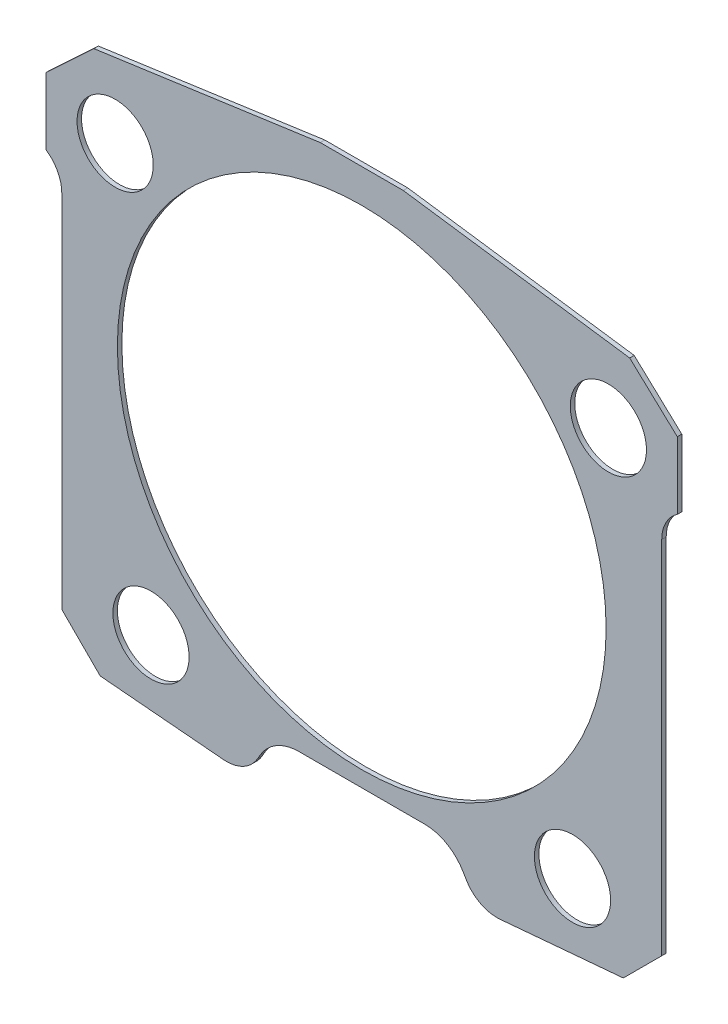
ISO-10303-21;
HEADER;
FILE_DESCRIPTION(('STEP AP214'),'2;1');
FILE_NAME('part.step','',(''),(''),'','','');
FILE_SCHEMA(('AUTOMOTIVE_DESIGN { 1 0 10303 214 1 1 1 1 }'));
ENDSEC;
DATA;
#1=APPLICATION_CONTEXT('core data for automotive mechanical design processes');
#2=APPLICATION_PROTOCOL_DEFINITION('international standard','automotive_design',2000,#1);
#3=PRODUCT_CONTEXT('',#1,'mechanical');
#4=PRODUCT('Part','Part','',(#3));
#5=PRODUCT_RELATED_PRODUCT_CATEGORY('part','',(#4));
#6=PRODUCT_DEFINITION_FORMATION('','',#4);
#7=PRODUCT_DEFINITION_CONTEXT('part definition',#1,'design');
#8=PRODUCT_DEFINITION('design','',#6,#7);
#9=PRODUCT_DEFINITION_SHAPE('','',#8);
#10=(LENGTH_UNIT() NAMED_UNIT(*) SI_UNIT(.MILLI.,.METRE.));
#11=(NAMED_UNIT(*) PLANE_ANGLE_UNIT() SI_UNIT($,.RADIAN.));
#12=(NAMED_UNIT(*) SI_UNIT($,.STERADIAN.) SOLID_ANGLE_UNIT());
#13=UNCERTAINTY_MEASURE_WITH_UNIT(LENGTH_MEASURE(1.E-05),#10,'distance_accuracy_value','');
#14=(GEOMETRIC_REPRESENTATION_CONTEXT(3) GLOBAL_UNCERTAINTY_ASSIGNED_CONTEXT((#13)) GLOBAL_UNIT_ASSIGNED_CONTEXT((#10,
#11,#12)) REPRESENTATION_CONTEXT('',''));
#15=CARTESIAN_POINT('',(0.,0.,0.));
#16=DIRECTION('',(0.,0.,1.));
#17=DIRECTION('',(1.,0.,0.));
#18=AXIS2_PLACEMENT_3D('',#15,#16,#17);
#19=CARTESIAN_POINT('',(30.1658075373095,-60.,1.));
#20=DIRECTION('',(0.,0.,1.));
#21=DIRECTION('',(1.,0.,0.));
#22=AXIS2_PLACEMENT_3D('',#19,#20,#21);
#23=PLANE('',#22);
#24=CARTESIAN_POINT('',(47.,-52.,1.));
#25=DIRECTION('',(0.,0.,1.));
#26=DIRECTION('',(1.,0.,0.));
#27=AXIS2_PLACEMENT_3D('',#24,#25,#26);
#28=CIRCLE('',#27,8.5);
#29=CARTESIAN_POINT('',(55.5,-52.,1.));
#30=VERTEX_POINT('',#29);
#31=EDGE_CURVE('E433',#30,#30,#28,.T.);
#32=ORIENTED_EDGE('',*,*,#31,.F.);
#33=EDGE_LOOP('',(#32));
#34=FACE_BOUND('',#33,.T.);
#35=CARTESIAN_POINT('',(55.,39.,1.));
#36=DIRECTION('',(0.,0.,1.));
#37=DIRECTION('',(1.,0.,0.));
#38=AXIS2_PLACEMENT_3D('',#35,#36,#37);
#39=CIRCLE('',#38,8.5);
#40=CARTESIAN_POINT('',(63.5,39.,1.));
#41=VERTEX_POINT('',#40);
#42=EDGE_CURVE('E445',#41,#41,#39,.T.);
#43=ORIENTED_EDGE('',*,*,#42,.F.);
#44=EDGE_LOOP('',(#43));
#45=FACE_BOUND('',#44,.T.);
#46=DIRECTION('',(0.707106781186541,0.707106781186554,0.));
#47=VECTOR('',#46,1.);
#48=CARTESIAN_POINT('',(66.9,-57.,1.));
#49=LINE('',#48,#47);
#50=CARTESIAN_POINT('',(58.3338233579808,-65.5661766420194,1.));
#51=VERTEX_POINT('',#50);
#52=CARTESIAN_POINT('',(66.9,-57.,1.));
#53=VERTEX_POINT('',#52);
#54=EDGE_CURVE('E265',#51,#53,#49,.T.);
#55=ORIENTED_EDGE('',*,*,#54,.T.);
#56=DIRECTION('',(0.,1.,0.));
#57=VECTOR('',#56,1.);
#58=CARTESIAN_POINT('',(66.9,-57.,1.));
#59=LINE('',#58,#57);
#60=CARTESIAN_POINT('',(66.9,23.4026994156701,1.));
#61=VERTEX_POINT('',#60);
#62=EDGE_CURVE('E143',#53,#61,#59,.T.);
#63=ORIENTED_EDGE('',*,*,#62,.T.);
#64=CARTESIAN_POINT('',(74.9,23.4026994156701,1.));
#65=DIRECTION('',(0.,0.,-1.));
#66=DIRECTION('',(1.,0.,0.));
#67=AXIS2_PLACEMENT_3D('',#64,#65,#66);
#68=CIRCLE('',#67,8.);
#69=CARTESIAN_POINT('',(70.375,30.,1.));
#70=VERTEX_POINT('',#69);
#71=EDGE_CURVE('E322',#61,#70,#68,.T.);
#72=ORIENTED_EDGE('',*,*,#71,.T.);
#73=DIRECTION('',(0.,1.,0.));
#74=VECTOR('',#73,1.);
#75=CARTESIAN_POINT('',(70.375,44.99762279539,1.));
#76=LINE('',#75,#74);
#77=CARTESIAN_POINT('',(70.375,44.99762279539,1.));
#78=VERTEX_POINT('',#77);
#79=EDGE_CURVE('E341',#70,#78,#76,.T.);
#80=ORIENTED_EDGE('',*,*,#79,.T.);
#81=DIRECTION('',(-0.731353701619169,0.6819983600625,0.));
#82=VECTOR('',#81,1.);
#83=CARTESIAN_POINT('',(59.7536715058201,54.9021718510366,1.));
#84=LINE('',#83,#82);
#85=CARTESIAN_POINT('',(59.7536715058201,54.9021718510366,1.));
#86=VERTEX_POINT('',#85);
#87=EDGE_CURVE('E338',#78,#86,#84,.T.);
#88=ORIENTED_EDGE('',*,*,#87,.T.);
#89=DIRECTION('',(-0.99026806874157,0.139173100960066,0.));
#90=VECTOR('',#89,1.);
#91=CARTESIAN_POINT('',(9.25,62.,1.));
#92=LINE('',#91,#90);
#93=CARTESIAN_POINT('',(9.25,62.,1.));
#94=VERTEX_POINT('',#93);
#95=EDGE_CURVE('E340',#86,#94,#92,.T.);
#96=ORIENTED_EDGE('',*,*,#95,.T.);
#97=DIRECTION('',(-1.,0.,0.));
#98=VECTOR('',#97,1.);
#99=CARTESIAN_POINT('',(-9.25,62.,1.));
#100=LINE('',#99,#98);
#101=CARTESIAN_POINT('',(-9.25,62.,1.));
#102=VERTEX_POINT('',#101);
#103=EDGE_CURVE('E343',#94,#102,#100,.T.);
#104=ORIENTED_EDGE('',*,*,#103,.T.);
#105=DIRECTION('',(-0.99026806874157,-0.139173100960066,0.));
#106=VECTOR('',#105,1.);
#107=CARTESIAN_POINT('',(-9.25,62.,1.));
#108=LINE('',#107,#106);
#109=CARTESIAN_POINT('',(-59.7536715058201,54.9021718510366,1.));
#110=VERTEX_POINT('',#109);
#111=EDGE_CURVE('E349',#102,#110,#108,.T.);
#112=ORIENTED_EDGE('',*,*,#111,.T.);
#113=DIRECTION('',(-0.731353701619169,-0.6819983600625,0.));
#114=VECTOR('',#113,1.);
#115=CARTESIAN_POINT('',(-59.7536715058201,54.9021718510366,1.));
#116=LINE('',#115,#114);
#117=CARTESIAN_POINT('',(-70.375,44.99762279539,1.));
#118=VERTEX_POINT('',#117);
#119=EDGE_CURVE('E351',#110,#118,#116,.T.);
#120=ORIENTED_EDGE('',*,*,#119,.T.);
#121=DIRECTION('',(0.,-1.,0.));
#122=VECTOR('',#121,1.);
#123=CARTESIAN_POINT('',(-70.375,44.99762279539,1.));
#124=LINE('',#123,#122);
#125=CARTESIAN_POINT('',(-70.375,30.,1.));
#126=VERTEX_POINT('',#125);
#127=EDGE_CURVE('E353',#118,#126,#124,.T.);
#128=ORIENTED_EDGE('',*,*,#127,.T.);
#129=CARTESIAN_POINT('',(-74.9,23.4026994156701,1.));
#130=DIRECTION('',(0.,0.,-1.));
#131=DIRECTION('',(-1.,0.,0.));
#132=AXIS2_PLACEMENT_3D('',#129,#130,#131);
#133=CIRCLE('',#132,8.);
#134=CARTESIAN_POINT('',(-66.9,23.4026994156701,1.));
#135=VERTEX_POINT('',#134);
#136=EDGE_CURVE('E355',#126,#135,#133,.T.);
#137=ORIENTED_EDGE('',*,*,#136,.T.);
#138=DIRECTION('',(0.,-1.,0.));
#139=VECTOR('',#138,1.);
#140=CARTESIAN_POINT('',(-66.9,-57.,1.));
#141=LINE('',#140,#139);
#142=CARTESIAN_POINT('',(-66.9,-57.,1.));
#143=VERTEX_POINT('',#142);
#144=EDGE_CURVE('E357',#135,#143,#141,.T.);
#145=ORIENTED_EDGE('',*,*,#144,.T.);
#146=DIRECTION('',(0.707106781186541,-0.707106781186554,0.));
#147=VECTOR('',#146,1.);
#148=CARTESIAN_POINT('',(-66.9,-57.,1.));
#149=LINE('',#148,#147);
#150=CARTESIAN_POINT('',(-58.3338233579808,-65.5661766420193,1.));
#151=VERTEX_POINT('',#150);
#152=EDGE_CURVE('E359',#143,#151,#149,.T.);
#153=ORIENTED_EDGE('',*,*,#152,.T.);
#154=DIRECTION('',(0.996194698091746,-0.0871557427476517,0.));
#155=VECTOR('',#154,1.);
#156=CARTESIAN_POINT('',(-58.3338233579808,-65.5661766420193,1.));
#157=LINE('',#156,#155);
#158=CARTESIAN_POINT('',(-30.8630534792907,-67.969557584734,1.));
#159=VERTEX_POINT('',#158);
#160=EDGE_CURVE('E361',#151,#159,#157,.T.);
#161=ORIENTED_EDGE('',*,*,#160,.T.);
#162=CARTESIAN_POINT('',(-30.1658075373095,-60.,1.));
#163=DIRECTION('',(0.,0.,1.));
#164=DIRECTION('',(-1.,0.,0.));
#165=AXIS2_PLACEMENT_3D('',#162,#163,#164);
#166=CIRCLE('',#165,7.99999999999999);
#167=CARTESIAN_POINT('',(-23.237604307034,-64.,1.));
#168=VERTEX_POINT('',#167);
#169=EDGE_CURVE('E363',#159,#168,#166,.T.);
#170=ORIENTED_EDGE('',*,*,#169,.T.);
#171=DIRECTION('',(0.500000000000004,0.866025403784436,0.));
#172=VECTOR('',#171,1.);
#173=CARTESIAN_POINT('',(-22.6602540378444,-63.,1.));
#174=LINE('',#173,#172);
#175=CARTESIAN_POINT('',(-22.6602540378444,-63.,1.));
#176=VERTEX_POINT('',#175);
#177=EDGE_CURVE('E365',#168,#176,#174,.T.);
#178=ORIENTED_EDGE('',*,*,#177,.T.);
#179=CARTESIAN_POINT('',(-14.,-68.,1.));
#180=DIRECTION('',(0.,0.,-1.));
#181=DIRECTION('',(1.,0.,0.));
#182=AXIS2_PLACEMENT_3D('',#179,#180,#181);
#183=CIRCLE('',#182,10.);
#184=CARTESIAN_POINT('',(-14.,-58.,1.));
#185=VERTEX_POINT('',#184);
#186=EDGE_CURVE('E367',#176,#185,#183,.T.);
#187=ORIENTED_EDGE('',*,*,#186,.T.);
#188=DIRECTION('',(1.,0.,0.));
#189=VECTOR('',#188,1.);
#190=CARTESIAN_POINT('',(-14.,-58.,1.));
#191=LINE('',#190,#189);
#192=CARTESIAN_POINT('',(14.,-58.,1.));
#193=VERTEX_POINT('',#192);
#194=EDGE_CURVE('E369',#185,#193,#191,.T.);
#195=ORIENTED_EDGE('',*,*,#194,.T.);
#196=CARTESIAN_POINT('',(14.,-68.,1.));
#197=DIRECTION('',(0.,0.,-1.));
#198=DIRECTION('',(-1.,0.,0.));
#199=AXIS2_PLACEMENT_3D('',#196,#197,#198);
#200=CIRCLE('',#199,10.);
#201=CARTESIAN_POINT('',(22.6602540378444,-63.,1.));
#202=VERTEX_POINT('',#201);
#203=EDGE_CURVE('E204',#193,#202,#200,.T.);
#204=ORIENTED_EDGE('',*,*,#203,.T.);
#205=DIRECTION('',(0.499999999999984,-0.866025403784448,0.));
#206=VECTOR('',#205,1.);
#207=CARTESIAN_POINT('',(22.6602540378444,-63.,1.));
#208=LINE('',#207,#206);
#209=CARTESIAN_POINT('',(23.237604307034,-64.,1.));
#210=VERTEX_POINT('',#209);
#211=EDGE_CURVE('E198',#202,#210,#208,.T.);
#212=ORIENTED_EDGE('',*,*,#211,.T.);
#213=CARTESIAN_POINT('',(30.1658075373095,-60.,1.));
#214=DIRECTION('',(0.,0.,1.));
#215=DIRECTION('',(1.,0.,0.));
#216=AXIS2_PLACEMENT_3D('',#213,#214,#215);
#217=CIRCLE('',#216,8.00000000000001);
#218=CARTESIAN_POINT('',(30.8630534792907,-67.969557584734,1.));
#219=VERTEX_POINT('',#218);
#220=EDGE_CURVE('E202',#210,#219,#217,.T.);
#221=ORIENTED_EDGE('',*,*,#220,.T.);
#222=DIRECTION('',(0.996194698091746,0.0871557427476518,0.));
#223=VECTOR('',#222,1.);
#224=CARTESIAN_POINT('',(58.3338233579808,-65.5661766420194,1.));
#225=LINE('',#224,#223);
#226=EDGE_CURVE('E58',#219,#51,#225,.T.);
#227=ORIENTED_EDGE('',*,*,#226,.T.);
#228=EDGE_LOOP('',(#55,#63,#72,#80,#88,#96,#104,#112,#120,#128,#137,#145,#153,#161,#170,#178,
#187,#195,#204,#212,#221,#227));
#229=FACE_BOUND('',#228,.T.);
#230=CARTESIAN_POINT('',(0.,0.,1.));
#231=DIRECTION('',(0.,0.,1.));
#232=DIRECTION('',(1.,0.,0.));
#233=AXIS2_PLACEMENT_3D('',#230,#231,#232);
#234=CIRCLE('',#233,54.5);
#235=CARTESIAN_POINT('',(54.5,0.,1.));
#236=VERTEX_POINT('',#235);
#237=EDGE_CURVE('E226',#236,#236,#234,.T.);
#238=ORIENTED_EDGE('',*,*,#237,.F.);
#239=EDGE_LOOP('',(#238));
#240=FACE_BOUND('',#239,.T.);
#241=CARTESIAN_POINT('',(-55.,39.,1.));
#242=DIRECTION('',(0.,0.,1.));
#243=DIRECTION('',(-1.,0.,0.));
#244=AXIS2_PLACEMENT_3D('',#241,#242,#243);
#245=CIRCLE('',#244,8.5);
#246=CARTESIAN_POINT('',(-63.5,39.,1.));
#247=VERTEX_POINT('',#246);
#248=EDGE_CURVE('E439',#247,#247,#245,.T.);
#249=ORIENTED_EDGE('',*,*,#248,.F.);
#250=EDGE_LOOP('',(#249));
#251=FACE_BOUND('',#250,.T.);
#252=CARTESIAN_POINT('',(-47.,-52.,1.));
#253=DIRECTION('',(0.,0.,1.));
#254=DIRECTION('',(-1.,0.,0.));
#255=AXIS2_PLACEMENT_3D('',#252,#253,#254);
#256=CIRCLE('',#255,8.5);
#257=CARTESIAN_POINT('',(-55.5,-52.,1.));
#258=VERTEX_POINT('',#257);
#259=EDGE_CURVE('E424',#258,#258,#256,.T.);
#260=ORIENTED_EDGE('',*,*,#259,.F.);
#261=EDGE_LOOP('',(#260));
#262=FACE_BOUND('',#261,.T.);
#263=ADVANCED_FACE('F41',(#34,#45,#229,#240,#251,#262),#23,.T.);
#264=CARTESIAN_POINT('',(30.1658075373095,-60.,0.));
#265=DIRECTION('',(0.,0.,1.));
#266=DIRECTION('',(1.,0.,0.));
#267=AXIS2_PLACEMENT_3D('',#264,#265,#266);
#268=PLANE('',#267);
#269=DIRECTION('',(0.707106781186541,0.707106781186554,0.));
#270=VECTOR('',#269,1.);
#271=CARTESIAN_POINT('',(66.9,-57.,0.));
#272=LINE('',#271,#270);
#273=CARTESIAN_POINT('',(58.3338233579808,-65.5661766420194,0.));
#274=VERTEX_POINT('',#273);
#275=CARTESIAN_POINT('',(66.9,-57.,0.));
#276=VERTEX_POINT('',#275);
#277=EDGE_CURVE('E222',#274,#276,#272,.T.);
#278=ORIENTED_EDGE('',*,*,#277,.F.);
#279=DIRECTION('',(0.996194698091746,0.0871557427476518,0.));
#280=VECTOR('',#279,1.);
#281=CARTESIAN_POINT('',(58.3338233579808,-65.5661766420194,0.));
#282=LINE('',#281,#280);
#283=CARTESIAN_POINT('',(30.8630534792907,-67.969557584734,0.));
#284=VERTEX_POINT('',#283);
#285=EDGE_CURVE('E135',#284,#274,#282,.T.);
#286=ORIENTED_EDGE('',*,*,#285,.F.);
#287=CARTESIAN_POINT('',(30.1658075373095,-60.,0.));
#288=DIRECTION('',(0.,0.,1.));
#289=DIRECTION('',(1.,0.,0.));
#290=AXIS2_PLACEMENT_3D('',#287,#288,#289);
#291=CIRCLE('',#290,8.00000000000001);
#292=CARTESIAN_POINT('',(23.237604307034,-64.,0.));
#293=VERTEX_POINT('',#292);
#294=EDGE_CURVE('E129',#293,#284,#291,.T.);
#295=ORIENTED_EDGE('',*,*,#294,.F.);
#296=DIRECTION('',(0.499999999999984,-0.866025403784448,0.));
#297=VECTOR('',#296,1.);
#298=CARTESIAN_POINT('',(22.6602540378444,-63.,0.));
#299=LINE('',#298,#297);
#300=CARTESIAN_POINT('',(22.6602540378444,-63.,0.));
#301=VERTEX_POINT('',#300);
#302=EDGE_CURVE('E212',#301,#293,#299,.T.);
#303=ORIENTED_EDGE('',*,*,#302,.F.);
#304=CARTESIAN_POINT('',(14.,-68.,0.));
#305=DIRECTION('',(0.,0.,-1.));
#306=DIRECTION('',(-1.,0.,0.));
#307=AXIS2_PLACEMENT_3D('',#304,#305,#306);
#308=CIRCLE('',#307,10.);
#309=CARTESIAN_POINT('',(14.,-58.,0.));
#310=VERTEX_POINT('',#309);
#311=EDGE_CURVE('E260',#310,#301,#308,.T.);
#312=ORIENTED_EDGE('',*,*,#311,.F.);
#313=DIRECTION('',(1.,0.,0.));
#314=VECTOR('',#313,1.);
#315=CARTESIAN_POINT('',(-14.,-58.,0.));
#316=LINE('',#315,#314);
#317=CARTESIAN_POINT('',(-14.,-58.,0.));
#318=VERTEX_POINT('',#317);
#319=EDGE_CURVE('E258',#318,#310,#316,.T.);
#320=ORIENTED_EDGE('',*,*,#319,.F.);
#321=CARTESIAN_POINT('',(-14.,-68.,0.));
#322=DIRECTION('',(0.,0.,-1.));
#323=DIRECTION('',(1.,0.,0.));
#324=AXIS2_PLACEMENT_3D('',#321,#322,#323);
#325=CIRCLE('',#324,10.);
#326=CARTESIAN_POINT('',(-22.6602540378444,-63.,0.));
#327=VERTEX_POINT('',#326);
#328=EDGE_CURVE('E256',#327,#318,#325,.T.);
#329=ORIENTED_EDGE('',*,*,#328,.F.);
#330=DIRECTION('',(0.500000000000004,0.866025403784436,0.));
#331=VECTOR('',#330,1.);
#332=CARTESIAN_POINT('',(-22.6602540378444,-63.,0.));
#333=LINE('',#332,#331);
#334=CARTESIAN_POINT('',(-23.237604307034,-64.,0.));
#335=VERTEX_POINT('',#334);
#336=EDGE_CURVE('E254',#335,#327,#333,.T.);
#337=ORIENTED_EDGE('',*,*,#336,.F.);
#338=CARTESIAN_POINT('',(-30.1658075373095,-60.,0.));
#339=DIRECTION('',(0.,0.,1.));
#340=DIRECTION('',(-1.,0.,0.));
#341=AXIS2_PLACEMENT_3D('',#338,#339,#340);
#342=CIRCLE('',#341,7.99999999999999);
#343=CARTESIAN_POINT('',(-30.8630534792907,-67.969557584734,0.));
#344=VERTEX_POINT('',#343);
#345=EDGE_CURVE('E252',#344,#335,#342,.T.);
#346=ORIENTED_EDGE('',*,*,#345,.F.);
#347=DIRECTION('',(0.996194698091746,-0.0871557427476517,0.));
#348=VECTOR('',#347,1.);
#349=CARTESIAN_POINT('',(-58.3338233579808,-65.5661766420193,0.));
#350=LINE('',#349,#348);
#351=CARTESIAN_POINT('',(-58.3338233579808,-65.5661766420193,0.));
#352=VERTEX_POINT('',#351);
#353=EDGE_CURVE('E250',#352,#344,#350,.T.);
#354=ORIENTED_EDGE('',*,*,#353,.F.);
#355=DIRECTION('',(0.707106781186541,-0.707106781186554,0.));
#356=VECTOR('',#355,1.);
#357=CARTESIAN_POINT('',(-66.9,-57.,0.));
#358=LINE('',#357,#356);
#359=CARTESIAN_POINT('',(-66.9,-57.,0.));
#360=VERTEX_POINT('',#359);
#361=EDGE_CURVE('E248',#360,#352,#358,.T.);
#362=ORIENTED_EDGE('',*,*,#361,.F.);
#363=DIRECTION('',(0.,-1.,0.));
#364=VECTOR('',#363,1.);
#365=CARTESIAN_POINT('',(-66.9,-57.,0.));
#366=LINE('',#365,#364);
#367=CARTESIAN_POINT('',(-66.9,23.4026994156701,0.));
#368=VERTEX_POINT('',#367);
#369=EDGE_CURVE('E246',#368,#360,#366,.T.);
#370=ORIENTED_EDGE('',*,*,#369,.F.);
#371=CARTESIAN_POINT('',(-74.9,23.4026994156701,0.));
#372=DIRECTION('',(0.,0.,-1.));
#373=DIRECTION('',(-1.,0.,0.));
#374=AXIS2_PLACEMENT_3D('',#371,#372,#373);
#375=CIRCLE('',#374,8.);
#376=CARTESIAN_POINT('',(-70.375,30.,0.));
#377=VERTEX_POINT('',#376);
#378=EDGE_CURVE('E244',#377,#368,#375,.T.);
#379=ORIENTED_EDGE('',*,*,#378,.F.);
#380=DIRECTION('',(0.,-1.,0.));
#381=VECTOR('',#380,1.);
#382=CARTESIAN_POINT('',(-70.375,44.99762279539,0.));
#383=LINE('',#382,#381);
#384=CARTESIAN_POINT('',(-70.375,44.99762279539,0.));
#385=VERTEX_POINT('',#384);
#386=EDGE_CURVE('E242',#385,#377,#383,.T.);
#387=ORIENTED_EDGE('',*,*,#386,.F.);
#388=DIRECTION('',(-0.731353701619169,-0.6819983600625,0.));
#389=VECTOR('',#388,1.);
#390=CARTESIAN_POINT('',(-59.7536715058201,54.9021718510366,0.));
#391=LINE('',#390,#389);
#392=CARTESIAN_POINT('',(-59.7536715058201,54.9021718510366,0.));
#393=VERTEX_POINT('',#392);
#394=EDGE_CURVE('E240',#393,#385,#391,.T.);
#395=ORIENTED_EDGE('',*,*,#394,.F.);
#396=DIRECTION('',(-0.99026806874157,-0.139173100960066,0.));
#397=VECTOR('',#396,1.);
#398=CARTESIAN_POINT('',(-9.25,62.,0.));
#399=LINE('',#398,#397);
#400=CARTESIAN_POINT('',(-9.25,62.,0.));
#401=VERTEX_POINT('',#400);
#402=EDGE_CURVE('E238',#401,#393,#399,.T.);
#403=ORIENTED_EDGE('',*,*,#402,.F.);
#404=DIRECTION('',(-1.,0.,0.));
#405=VECTOR('',#404,1.);
#406=CARTESIAN_POINT('',(-9.25,62.,0.));
#407=LINE('',#406,#405);
#408=CARTESIAN_POINT('',(9.25,62.,0.));
#409=VERTEX_POINT('',#408);
#410=EDGE_CURVE('E236',#409,#401,#407,.T.);
#411=ORIENTED_EDGE('',*,*,#410,.F.);
#412=DIRECTION('',(-0.99026806874157,0.139173100960066,0.));
#413=VECTOR('',#412,1.);
#414=CARTESIAN_POINT('',(9.25,62.,0.));
#415=LINE('',#414,#413);
#416=CARTESIAN_POINT('',(59.7536715058201,54.9021718510366,0.));
#417=VERTEX_POINT('',#416);
#418=EDGE_CURVE('E234',#417,#409,#415,.T.);
#419=ORIENTED_EDGE('',*,*,#418,.F.);
#420=DIRECTION('',(-0.731353701619169,0.6819983600625,0.));
#421=VECTOR('',#420,1.);
#422=CARTESIAN_POINT('',(59.7536715058201,54.9021718510366,0.));
#423=LINE('',#422,#421);
#424=CARTESIAN_POINT('',(70.375,44.99762279539,0.));
#425=VERTEX_POINT('',#424);
#426=EDGE_CURVE('E232',#425,#417,#423,.T.);
#427=ORIENTED_EDGE('',*,*,#426,.F.);
#428=DIRECTION('',(0.,1.,0.));
#429=VECTOR('',#428,1.);
#430=CARTESIAN_POINT('',(70.375,44.99762279539,0.));
#431=LINE('',#430,#429);
#432=CARTESIAN_POINT('',(70.375,30.,0.));
#433=VERTEX_POINT('',#432);
#434=EDGE_CURVE('E230',#433,#425,#431,.T.);
#435=ORIENTED_EDGE('',*,*,#434,.F.);
#436=CARTESIAN_POINT('',(74.9,23.4026994156701,0.));
#437=DIRECTION('',(0.,0.,-1.));
#438=DIRECTION('',(1.,0.,0.));
#439=AXIS2_PLACEMENT_3D('',#436,#437,#438);
#440=CIRCLE('',#439,8.);
#441=CARTESIAN_POINT('',(66.9,23.4026994156701,0.));
#442=VERTEX_POINT('',#441);
#443=EDGE_CURVE('E228',#442,#433,#440,.T.);
#444=ORIENTED_EDGE('',*,*,#443,.F.);
#445=DIRECTION('',(0.,1.,0.));
#446=VECTOR('',#445,1.);
#447=CARTESIAN_POINT('',(66.9,-57.,0.));
#448=LINE('',#447,#446);
#449=EDGE_CURVE('E225',#276,#442,#448,.T.);
#450=ORIENTED_EDGE('',*,*,#449,.F.);
#451=EDGE_LOOP('',(#278,#286,#295,#303,#312,#320,#329,#337,#346,#354,#362,#370,#379,#387,#395,
#403,#411,#419,#427,#435,#444,#450));
#452=FACE_BOUND('',#451,.T.);
#453=CARTESIAN_POINT('',(0.,0.,0.));
#454=DIRECTION('',(0.,0.,1.));
#455=DIRECTION('',(1.,0.,0.));
#456=AXIS2_PLACEMENT_3D('',#453,#454,#455);
#457=CIRCLE('',#456,54.5);
#458=CARTESIAN_POINT('',(54.5,0.,0.));
#459=VERTEX_POINT('',#458);
#460=EDGE_CURVE('E448',#459,#459,#457,.T.);
#461=ORIENTED_EDGE('',*,*,#460,.T.);
#462=EDGE_LOOP('',(#461));
#463=FACE_BOUND('',#462,.T.);
#464=CARTESIAN_POINT('',(55.,39.,0.));
#465=DIRECTION('',(0.,0.,1.));
#466=DIRECTION('',(1.,0.,0.));
#467=AXIS2_PLACEMENT_3D('',#464,#465,#466);
#468=CIRCLE('',#467,8.5);
#469=CARTESIAN_POINT('',(63.5,39.,0.));
#470=VERTEX_POINT('',#469);
#471=EDGE_CURVE('E442',#470,#470,#468,.T.);
#472=ORIENTED_EDGE('',*,*,#471,.T.);
#473=EDGE_LOOP('',(#472));
#474=FACE_BOUND('',#473,.T.);
#475=CARTESIAN_POINT('',(-55.,39.,0.));
#476=DIRECTION('',(0.,0.,1.));
#477=DIRECTION('',(-1.,0.,0.));
#478=AXIS2_PLACEMENT_3D('',#475,#476,#477);
#479=CIRCLE('',#478,8.5);
#480=CARTESIAN_POINT('',(-63.5,39.,0.));
#481=VERTEX_POINT('',#480);
#482=EDGE_CURVE('E436',#481,#481,#479,.T.);
#483=ORIENTED_EDGE('',*,*,#482,.T.);
#484=EDGE_LOOP('',(#483));
#485=FACE_BOUND('',#484,.T.);
#486=CARTESIAN_POINT('',(47.,-52.,0.));
#487=DIRECTION('',(0.,0.,1.));
#488=DIRECTION('',(1.,0.,0.));
#489=AXIS2_PLACEMENT_3D('',#486,#487,#488);
#490=CIRCLE('',#489,8.5);
#491=CARTESIAN_POINT('',(55.5,-52.,0.));
#492=VERTEX_POINT('',#491);
#493=EDGE_CURVE('E430',#492,#492,#490,.T.);
#494=ORIENTED_EDGE('',*,*,#493,.T.);
#495=EDGE_LOOP('',(#494));
#496=FACE_BOUND('',#495,.T.);
#497=CARTESIAN_POINT('',(-47.,-52.,0.));
#498=DIRECTION('',(0.,0.,1.));
#499=DIRECTION('',(-1.,0.,0.));
#500=AXIS2_PLACEMENT_3D('',#497,#498,#499);
#501=CIRCLE('',#500,8.5);
#502=CARTESIAN_POINT('',(-55.5,-52.,0.));
#503=VERTEX_POINT('',#502);
#504=EDGE_CURVE('E427',#503,#503,#501,.T.);
#505=ORIENTED_EDGE('',*,*,#504,.T.);
#506=EDGE_LOOP('',(#505));
#507=FACE_BOUND('',#506,.T.);
#508=ADVANCED_FACE('F326',(#452,#463,#474,#485,#496,#507),#268,.F.);
#509=CARTESIAN_POINT('',(66.9,-57.,1.));
#510=DIRECTION('',(-0.707106781186554,0.707106781186541,0.));
#511=DIRECTION('',(-0.707106781186541,-0.707106781186554,0.));
#512=AXIS2_PLACEMENT_3D('',#509,#510,#511);
#513=PLANE('',#512);
#514=ORIENTED_EDGE('',*,*,#277,.T.);
#515=DIRECTION('',(0.,0.,-1.));
#516=VECTOR('',#515,1.);
#517=CARTESIAN_POINT('',(66.9,-57.,1.));
#518=LINE('',#517,#516);
#519=EDGE_CURVE('E11',#53,#276,#518,.T.);
#520=ORIENTED_EDGE('',*,*,#519,.F.);
#521=ORIENTED_EDGE('',*,*,#54,.F.);
#522=DIRECTION('',(0.,0.,-1.));
#523=VECTOR('',#522,1.);
#524=CARTESIAN_POINT('',(58.3338233579808,-65.5661766420194,1.));
#525=LINE('',#524,#523);
#526=EDGE_CURVE('E218',#51,#274,#525,.T.);
#527=ORIENTED_EDGE('',*,*,#526,.T.);
#528=EDGE_LOOP('',(#514,#520,#521,#527));
#529=FACE_BOUND('',#528,.T.);
#530=ADVANCED_FACE('F43',(#529),#513,.F.);
#531=CARTESIAN_POINT('',(66.9,-57.,1.));
#532=DIRECTION('',(-1.,0.,0.));
#533=DIRECTION('',(0.,0.,1.));
#534=AXIS2_PLACEMENT_3D('',#531,#532,#533);
#535=PLANE('',#534);
#536=ORIENTED_EDGE('',*,*,#449,.T.);
#537=DIRECTION('',(0.,0.,-1.));
#538=VECTOR('',#537,1.);
#539=CARTESIAN_POINT('',(66.9,23.4026994156701,1.));
#540=LINE('',#539,#538);
#541=EDGE_CURVE('E50',#61,#442,#540,.T.);
#542=ORIENTED_EDGE('',*,*,#541,.F.);
#543=ORIENTED_EDGE('',*,*,#62,.F.);
#544=ORIENTED_EDGE('',*,*,#519,.T.);
#545=EDGE_LOOP('',(#536,#542,#543,#544));
#546=FACE_BOUND('',#545,.T.);
#547=ADVANCED_FACE('F672',(#546),#535,.F.);
#548=CARTESIAN_POINT('',(74.9,23.4026994156701,1.));
#549=DIRECTION('',(0.,0.,-1.));
#550=DIRECTION('',(-1.,0.,0.));
#551=AXIS2_PLACEMENT_3D('',#548,#549,#550);
#552=CYLINDRICAL_SURFACE('',#551,8.);
#553=ORIENTED_EDGE('',*,*,#443,.T.);
#554=DIRECTION('',(0.,0.,-1.));
#555=VECTOR('',#554,1.);
#556=CARTESIAN_POINT('',(70.375,30.,1.));
#557=LINE('',#556,#555);
#558=EDGE_CURVE('E314',#70,#433,#557,.T.);
#559=ORIENTED_EDGE('',*,*,#558,.F.);
#560=ORIENTED_EDGE('',*,*,#71,.F.);
#561=ORIENTED_EDGE('',*,*,#541,.T.);
#562=EDGE_LOOP('',(#553,#559,#560,#561));
#563=FACE_BOUND('',#562,.T.);
#564=ADVANCED_FACE('F320',(#563),#552,.F.);
#565=CARTESIAN_POINT('',(70.375,44.99762279539,1.));
#566=DIRECTION('',(-1.,0.,0.));
#567=DIRECTION('',(0.,0.,1.));
#568=AXIS2_PLACEMENT_3D('',#565,#566,#567);
#569=PLANE('',#568);
#570=ORIENTED_EDGE('',*,*,#434,.T.);
#571=DIRECTION('',(0.,0.,-1.));
#572=VECTOR('',#571,1.);
#573=CARTESIAN_POINT('',(70.375,44.99762279539,1.));
#574=LINE('',#573,#572);
#575=EDGE_CURVE('E311',#78,#425,#574,.T.);
#576=ORIENTED_EDGE('',*,*,#575,.F.);
#577=ORIENTED_EDGE('',*,*,#79,.F.);
#578=ORIENTED_EDGE('',*,*,#558,.T.);
#579=EDGE_LOOP('',(#570,#576,#577,#578));
#580=FACE_BOUND('',#579,.T.);
#581=ADVANCED_FACE('F332',(#580),#569,.F.);
#582=CARTESIAN_POINT('',(59.7536715058201,54.9021718510366,1.));
#583=DIRECTION('',(-0.6819983600625,-0.731353701619169,0.));
#584=DIRECTION('',(0.731353701619169,-0.6819983600625,0.));
#585=AXIS2_PLACEMENT_3D('',#582,#583,#584);
#586=PLANE('',#585);
#587=ORIENTED_EDGE('',*,*,#426,.T.);
#588=DIRECTION('',(0.,0.,-1.));
#589=VECTOR('',#588,1.);
#590=CARTESIAN_POINT('',(59.7536715058201,54.9021718510366,1.));
#591=LINE('',#590,#589);
#592=EDGE_CURVE('E308',#86,#417,#591,.T.);
#593=ORIENTED_EDGE('',*,*,#592,.F.);
#594=ORIENTED_EDGE('',*,*,#87,.F.);
#595=ORIENTED_EDGE('',*,*,#575,.T.);
#596=EDGE_LOOP('',(#587,#593,#594,#595));
#597=FACE_BOUND('',#596,.T.);
#598=ADVANCED_FACE('F336',(#597),#586,.F.);
#599=CARTESIAN_POINT('',(9.25,62.,1.));
#600=DIRECTION('',(-0.139173100960066,-0.99026806874157,0.));
#601=DIRECTION('',(0.99026806874157,-0.139173100960066,0.));
#602=AXIS2_PLACEMENT_3D('',#599,#600,#601);
#603=PLANE('',#602);
#604=ORIENTED_EDGE('',*,*,#418,.T.);
#605=DIRECTION('',(0.,0.,-1.));
#606=VECTOR('',#605,1.);
#607=CARTESIAN_POINT('',(9.25,62.,1.));
#608=LINE('',#607,#606);
#609=EDGE_CURVE('E305',#94,#409,#608,.T.);
#610=ORIENTED_EDGE('',*,*,#609,.F.);
#611=ORIENTED_EDGE('',*,*,#95,.F.);
#612=ORIENTED_EDGE('',*,*,#592,.T.);
#613=EDGE_LOOP('',(#604,#610,#611,#612));
#614=FACE_BOUND('',#613,.T.);
#615=ADVANCED_FACE('F637',(#614),#603,.F.);
#616=CARTESIAN_POINT('',(-9.25,62.,1.));
#617=DIRECTION('',(0.,-1.,0.));
#618=DIRECTION('',(0.,0.,-1.));
#619=AXIS2_PLACEMENT_3D('',#616,#617,#618);
#620=PLANE('',#619);
#621=ORIENTED_EDGE('',*,*,#410,.T.);
#622=DIRECTION('',(0.,0.,-1.));
#623=VECTOR('',#622,1.);
#624=CARTESIAN_POINT('',(-9.25,62.,1.));
#625=LINE('',#624,#623);
#626=EDGE_CURVE('E302',#102,#401,#625,.T.);
#627=ORIENTED_EDGE('',*,*,#626,.F.);
#628=ORIENTED_EDGE('',*,*,#103,.F.);
#629=ORIENTED_EDGE('',*,*,#609,.T.);
#630=EDGE_LOOP('',(#621,#627,#628,#629));
#631=FACE_BOUND('',#630,.T.);
#632=ADVANCED_FACE('F627',(#631),#620,.F.);
#633=CARTESIAN_POINT('',(-9.25,62.,1.));
#634=DIRECTION('',(0.139173100960066,-0.99026806874157,0.));
#635=DIRECTION('',(0.99026806874157,0.139173100960066,0.));
#636=AXIS2_PLACEMENT_3D('',#633,#634,#635);
#637=PLANE('',#636);
#638=ORIENTED_EDGE('',*,*,#402,.T.);
#639=DIRECTION('',(0.,0.,-1.));
#640=VECTOR('',#639,1.);
#641=CARTESIAN_POINT('',(-59.7536715058201,54.9021718510366,1.));
#642=LINE('',#641,#640);
#643=EDGE_CURVE('E299',#110,#393,#642,.T.);
#644=ORIENTED_EDGE('',*,*,#643,.F.);
#645=ORIENTED_EDGE('',*,*,#111,.F.);
#646=ORIENTED_EDGE('',*,*,#626,.T.);
#647=EDGE_LOOP('',(#638,#644,#645,#646));
#648=FACE_BOUND('',#647,.T.);
#649=ADVANCED_FACE('F617',(#648),#637,.F.);
#650=CARTESIAN_POINT('',(-59.7536715058201,54.9021718510366,1.));
#651=DIRECTION('',(0.6819983600625,-0.731353701619169,0.));
#652=DIRECTION('',(0.731353701619169,0.6819983600625,0.));
#653=AXIS2_PLACEMENT_3D('',#650,#651,#652);
#654=PLANE('',#653);
#655=ORIENTED_EDGE('',*,*,#394,.T.);
#656=DIRECTION('',(0.,0.,-1.));
#657=VECTOR('',#656,1.);
#658=CARTESIAN_POINT('',(-70.375,44.99762279539,1.));
#659=LINE('',#658,#657);
#660=EDGE_CURVE('E296',#118,#385,#659,.T.);
#661=ORIENTED_EDGE('',*,*,#660,.F.);
#662=ORIENTED_EDGE('',*,*,#119,.F.);
#663=ORIENTED_EDGE('',*,*,#643,.T.);
#664=EDGE_LOOP('',(#655,#661,#662,#663));
#665=FACE_BOUND('',#664,.T.);
#666=ADVANCED_FACE('F607',(#665),#654,.F.);
#667=CARTESIAN_POINT('',(-70.375,44.99762279539,1.));
#668=DIRECTION('',(1.,0.,0.));
#669=DIRECTION('',(0.,0.,-1.));
#670=AXIS2_PLACEMENT_3D('',#667,#668,#669);
#671=PLANE('',#670);
#672=ORIENTED_EDGE('',*,*,#386,.T.);
#673=DIRECTION('',(0.,0.,-1.));
#674=VECTOR('',#673,1.);
#675=CARTESIAN_POINT('',(-70.375,30.,1.));
#676=LINE('',#675,#674);
#677=EDGE_CURVE('E293',#126,#377,#676,.T.);
#678=ORIENTED_EDGE('',*,*,#677,.F.);
#679=ORIENTED_EDGE('',*,*,#127,.F.);
#680=ORIENTED_EDGE('',*,*,#660,.T.);
#681=EDGE_LOOP('',(#672,#678,#679,#680));
#682=FACE_BOUND('',#681,.T.);
#683=ADVANCED_FACE('F597',(#682),#671,.F.);
#684=CARTESIAN_POINT('',(-74.9,23.4026994156701,1.));
#685=DIRECTION('',(0.,0.,-1.));
#686=DIRECTION('',(-1.,0.,0.));
#687=AXIS2_PLACEMENT_3D('',#684,#685,#686);
#688=CYLINDRICAL_SURFACE('',#687,8.);
#689=ORIENTED_EDGE('',*,*,#378,.T.);
#690=DIRECTION('',(0.,0.,-1.));
#691=VECTOR('',#690,1.);
#692=CARTESIAN_POINT('',(-66.9,23.4026994156701,1.));
#693=LINE('',#692,#691);
#694=EDGE_CURVE('E290',#135,#368,#693,.T.);
#695=ORIENTED_EDGE('',*,*,#694,.F.);
#696=ORIENTED_EDGE('',*,*,#136,.F.);
#697=ORIENTED_EDGE('',*,*,#677,.T.);
#698=EDGE_LOOP('',(#689,#695,#696,#697));
#699=FACE_BOUND('',#698,.T.);
#700=ADVANCED_FACE('F587',(#699),#688,.F.);
#701=CARTESIAN_POINT('',(-66.9,-57.,1.));
#702=DIRECTION('',(1.,0.,0.));
#703=DIRECTION('',(0.,0.,-1.));
#704=AXIS2_PLACEMENT_3D('',#701,#702,#703);
#705=PLANE('',#704);
#706=ORIENTED_EDGE('',*,*,#369,.T.);
#707=DIRECTION('',(0.,0.,-1.));
#708=VECTOR('',#707,1.);
#709=CARTESIAN_POINT('',(-66.9,-57.,1.));
#710=LINE('',#709,#708);
#711=EDGE_CURVE('E287',#143,#360,#710,.T.);
#712=ORIENTED_EDGE('',*,*,#711,.F.);
#713=ORIENTED_EDGE('',*,*,#144,.F.);
#714=ORIENTED_EDGE('',*,*,#694,.T.);
#715=EDGE_LOOP('',(#706,#712,#713,#714));
#716=FACE_BOUND('',#715,.T.);
#717=ADVANCED_FACE('F577',(#716),#705,.F.);
#718=CARTESIAN_POINT('',(-66.9,-57.,1.));
#719=DIRECTION('',(0.707106781186554,0.707106781186541,0.));
#720=DIRECTION('',(-0.707106781186541,0.707106781186554,0.));
#721=AXIS2_PLACEMENT_3D('',#718,#719,#720);
#722=PLANE('',#721);
#723=ORIENTED_EDGE('',*,*,#361,.T.);
#724=DIRECTION('',(0.,0.,-1.));
#725=VECTOR('',#724,1.);
#726=CARTESIAN_POINT('',(-58.3338233579808,-65.5661766420193,1.));
#727=LINE('',#726,#725);
#728=EDGE_CURVE('E284',#151,#352,#727,.T.);
#729=ORIENTED_EDGE('',*,*,#728,.F.);
#730=ORIENTED_EDGE('',*,*,#152,.F.);
#731=ORIENTED_EDGE('',*,*,#711,.T.);
#732=EDGE_LOOP('',(#723,#729,#730,#731));
#733=FACE_BOUND('',#732,.T.);
#734=ADVANCED_FACE('F567',(#733),#722,.F.);
#735=CARTESIAN_POINT('',(-58.3338233579808,-65.5661766420193,1.));
#736=DIRECTION('',(0.0871557427476517,0.996194698091746,0.));
#737=DIRECTION('',(-0.996194698091746,0.0871557427476517,0.));
#738=AXIS2_PLACEMENT_3D('',#735,#736,#737);
#739=PLANE('',#738);
#740=ORIENTED_EDGE('',*,*,#353,.T.);
#741=DIRECTION('',(0.,0.,-1.));
#742=VECTOR('',#741,1.);
#743=CARTESIAN_POINT('',(-30.8630534792907,-67.969557584734,1.));
#744=LINE('',#743,#742);
#745=EDGE_CURVE('E281',#159,#344,#744,.T.);
#746=ORIENTED_EDGE('',*,*,#745,.F.);
#747=ORIENTED_EDGE('',*,*,#160,.F.);
#748=ORIENTED_EDGE('',*,*,#728,.T.);
#749=EDGE_LOOP('',(#740,#746,#747,#748));
#750=FACE_BOUND('',#749,.T.);
#751=ADVANCED_FACE('F557',(#750),#739,.F.);
#752=CARTESIAN_POINT('',(-30.1658075373095,-60.,1.));
#753=DIRECTION('',(0.,0.,-1.));
#754=DIRECTION('',(-1.,0.,0.));
#755=AXIS2_PLACEMENT_3D('',#752,#753,#754);
#756=CYLINDRICAL_SURFACE('',#755,7.99999999999999);
#757=ORIENTED_EDGE('',*,*,#345,.T.);
#758=DIRECTION('',(0.,0.,-1.));
#759=VECTOR('',#758,1.);
#760=CARTESIAN_POINT('',(-23.237604307034,-64.,1.));
#761=LINE('',#760,#759);
#762=EDGE_CURVE('E278',#168,#335,#761,.T.);
#763=ORIENTED_EDGE('',*,*,#762,.F.);
#764=ORIENTED_EDGE('',*,*,#169,.F.);
#765=ORIENTED_EDGE('',*,*,#745,.T.);
#766=EDGE_LOOP('',(#757,#763,#764,#765));
#767=FACE_BOUND('',#766,.T.);
#768=ADVANCED_FACE('F547',(#767),#756,.T.);
#769=CARTESIAN_POINT('',(-22.6602540378444,-63.,1.));
#770=DIRECTION('',(-0.866025403784436,0.500000000000004,0.));
#771=DIRECTION('',(-0.500000000000004,-0.866025403784437,0.));
#772=AXIS2_PLACEMENT_3D('',#769,#770,#771);
#773=PLANE('',#772);
#774=ORIENTED_EDGE('',*,*,#336,.T.);
#775=DIRECTION('',(0.,0.,-1.));
#776=VECTOR('',#775,1.);
#777=CARTESIAN_POINT('',(-22.6602540378444,-63.,1.));
#778=LINE('',#777,#776);
#779=EDGE_CURVE('E275',#176,#327,#778,.T.);
#780=ORIENTED_EDGE('',*,*,#779,.F.);
#781=ORIENTED_EDGE('',*,*,#177,.F.);
#782=ORIENTED_EDGE('',*,*,#762,.T.);
#783=EDGE_LOOP('',(#774,#780,#781,#782));
#784=FACE_BOUND('',#783,.T.);
#785=ADVANCED_FACE('F537',(#784),#773,.F.);
#786=CARTESIAN_POINT('',(-14.,-68.,1.));
#787=DIRECTION('',(0.,0.,-1.));
#788=DIRECTION('',(-1.,0.,0.));
#789=AXIS2_PLACEMENT_3D('',#786,#787,#788);
#790=CYLINDRICAL_SURFACE('',#789,10.);
#791=ORIENTED_EDGE('',*,*,#328,.T.);
#792=DIRECTION('',(0.,0.,-1.));
#793=VECTOR('',#792,1.);
#794=CARTESIAN_POINT('',(-14.,-58.,1.));
#795=LINE('',#794,#793);
#796=EDGE_CURVE('E272',#185,#318,#795,.T.);
#797=ORIENTED_EDGE('',*,*,#796,.F.);
#798=ORIENTED_EDGE('',*,*,#186,.F.);
#799=ORIENTED_EDGE('',*,*,#779,.T.);
#800=EDGE_LOOP('',(#791,#797,#798,#799));
#801=FACE_BOUND('',#800,.T.);
#802=ADVANCED_FACE('F528',(#801),#790,.F.);
#803=CARTESIAN_POINT('',(-14.,-58.,1.));
#804=DIRECTION('',(0.,1.,0.));
#805=DIRECTION('',(0.,0.,1.));
#806=AXIS2_PLACEMENT_3D('',#803,#804,#805);
#807=PLANE('',#806);
#808=ORIENTED_EDGE('',*,*,#319,.T.);
#809=DIRECTION('',(0.,0.,-1.));
#810=VECTOR('',#809,1.);
#811=CARTESIAN_POINT('',(14.,-58.,1.));
#812=LINE('',#811,#810);
#813=EDGE_CURVE('E269',#193,#310,#812,.T.);
#814=ORIENTED_EDGE('',*,*,#813,.F.);
#815=ORIENTED_EDGE('',*,*,#194,.F.);
#816=ORIENTED_EDGE('',*,*,#796,.T.);
#817=EDGE_LOOP('',(#808,#814,#815,#816));
#818=FACE_BOUND('',#817,.T.);
#819=ADVANCED_FACE('F375',(#818),#807,.F.);
#820=CARTESIAN_POINT('',(14.,-68.,1.));
#821=DIRECTION('',(0.,0.,-1.));
#822=DIRECTION('',(-1.,0.,0.));
#823=AXIS2_PLACEMENT_3D('',#820,#821,#822);
#824=CYLINDRICAL_SURFACE('',#823,10.);
#825=ORIENTED_EDGE('',*,*,#311,.T.);
#826=DIRECTION('',(0.,0.,-1.));
#827=VECTOR('',#826,1.);
#828=CARTESIAN_POINT('',(22.6602540378444,-63.,1.));
#829=LINE('',#828,#827);
#830=EDGE_CURVE('E213',#202,#301,#829,.T.);
#831=ORIENTED_EDGE('',*,*,#830,.F.);
#832=ORIENTED_EDGE('',*,*,#203,.F.);
#833=ORIENTED_EDGE('',*,*,#813,.T.);
#834=EDGE_LOOP('',(#825,#831,#832,#833));
#835=FACE_BOUND('',#834,.T.);
#836=ADVANCED_FACE('F379',(#835),#824,.F.);
#837=CARTESIAN_POINT('',(22.6602540378444,-63.,1.));
#838=DIRECTION('',(0.866025403784448,0.499999999999984,0.));
#839=DIRECTION('',(-0.499999999999984,0.866025403784448,0.));
#840=AXIS2_PLACEMENT_3D('',#837,#838,#839);
#841=PLANE('',#840);
#842=ORIENTED_EDGE('',*,*,#302,.T.);
#843=DIRECTION('',(0.,0.,-1.));
#844=VECTOR('',#843,1.);
#845=CARTESIAN_POINT('',(23.237604307034,-64.,1.));
#846=LINE('',#845,#844);
#847=EDGE_CURVE('E209',#210,#293,#846,.T.);
#848=ORIENTED_EDGE('',*,*,#847,.F.);
#849=ORIENTED_EDGE('',*,*,#211,.F.);
#850=ORIENTED_EDGE('',*,*,#830,.T.);
#851=EDGE_LOOP('',(#842,#848,#849,#850));
#852=FACE_BOUND('',#851,.T.);
#853=ADVANCED_FACE('F210',(#852),#841,.F.);
#854=CARTESIAN_POINT('',(30.1658075373095,-60.,1.));
#855=DIRECTION('',(0.,0.,-1.));
#856=DIRECTION('',(-1.,0.,0.));
#857=AXIS2_PLACEMENT_3D('',#854,#855,#856);
#858=CYLINDRICAL_SURFACE('',#857,8.00000000000001);
#859=ORIENTED_EDGE('',*,*,#294,.T.);
#860=DIRECTION('',(0.,0.,-1.));
#861=VECTOR('',#860,1.);
#862=CARTESIAN_POINT('',(30.8630534792907,-67.969557584734,1.));
#863=LINE('',#862,#861);
#864=EDGE_CURVE('E214',#219,#284,#863,.T.);
#865=ORIENTED_EDGE('',*,*,#864,.F.);
#866=ORIENTED_EDGE('',*,*,#220,.F.);
#867=ORIENTED_EDGE('',*,*,#847,.T.);
#868=EDGE_LOOP('',(#859,#865,#866,#867));
#869=FACE_BOUND('',#868,.T.);
#870=ADVANCED_FACE('F216',(#869),#858,.T.);
#871=CARTESIAN_POINT('',(58.3338233579808,-65.5661766420194,1.));
#872=DIRECTION('',(-0.0871557427476517,0.996194698091746,0.));
#873=DIRECTION('',(-0.996194698091746,-0.0871557427476518,0.));
#874=AXIS2_PLACEMENT_3D('',#871,#872,#873);
#875=PLANE('',#874);
#876=ORIENTED_EDGE('',*,*,#285,.T.);
#877=ORIENTED_EDGE('',*,*,#526,.F.);
#878=ORIENTED_EDGE('',*,*,#226,.F.);
#879=ORIENTED_EDGE('',*,*,#864,.T.);
#880=EDGE_LOOP('',(#876,#877,#878,#879));
#881=FACE_BOUND('',#880,.T.);
#882=ADVANCED_FACE('F383',(#881),#875,.F.);
#883=CARTESIAN_POINT('',(0.,0.,1.));
#884=DIRECTION('',(0.,0.,-1.));
#885=DIRECTION('',(-1.,0.,0.));
#886=AXIS2_PLACEMENT_3D('',#883,#884,#885);
#887=CYLINDRICAL_SURFACE('',#886,54.5);
#888=ORIENTED_EDGE('',*,*,#237,.T.);
#889=EDGE_LOOP('',(#888));
#890=FACE_BOUND('',#889,.T.);
#891=ORIENTED_EDGE('',*,*,#460,.F.);
#892=EDGE_LOOP('',(#891));
#893=FACE_BOUND('',#892,.T.);
#894=ADVANCED_FACE('F385',(#890,#893),#887,.F.);
#895=CARTESIAN_POINT('',(55.,39.,1.));
#896=DIRECTION('',(0.,0.,-1.));
#897=DIRECTION('',(-1.,0.,0.));
#898=AXIS2_PLACEMENT_3D('',#895,#896,#897);
#899=CYLINDRICAL_SURFACE('',#898,8.5);
#900=ORIENTED_EDGE('',*,*,#42,.T.);
#901=EDGE_LOOP('',(#900));
#902=FACE_BOUND('',#901,.T.);
#903=ORIENTED_EDGE('',*,*,#471,.F.);
#904=EDGE_LOOP('',(#903));
#905=FACE_BOUND('',#904,.T.);
#906=ADVANCED_FACE('F391',(#902,#905),#899,.F.);
#907=CARTESIAN_POINT('',(-55.,39.,1.));
#908=DIRECTION('',(0.,0.,-1.));
#909=DIRECTION('',(-1.,0.,0.));
#910=AXIS2_PLACEMENT_3D('',#907,#908,#909);
#911=CYLINDRICAL_SURFACE('',#910,8.5);
#912=ORIENTED_EDGE('',*,*,#248,.T.);
#913=EDGE_LOOP('',(#912));
#914=FACE_BOUND('',#913,.T.);
#915=ORIENTED_EDGE('',*,*,#482,.F.);
#916=EDGE_LOOP('',(#915));
#917=FACE_BOUND('',#916,.T.);
#918=ADVANCED_FACE('F407',(#914,#917),#911,.F.);
#919=CARTESIAN_POINT('',(47.,-52.,1.));
#920=DIRECTION('',(0.,0.,-1.));
#921=DIRECTION('',(-1.,0.,0.));
#922=AXIS2_PLACEMENT_3D('',#919,#920,#921);
#923=CYLINDRICAL_SURFACE('',#922,8.5);
#924=ORIENTED_EDGE('',*,*,#31,.T.);
#925=EDGE_LOOP('',(#924));
#926=FACE_BOUND('',#925,.T.);
#927=ORIENTED_EDGE('',*,*,#493,.F.);
#928=EDGE_LOOP('',(#927));
#929=FACE_BOUND('',#928,.T.);
#930=ADVANCED_FACE('F411',(#926,#929),#923,.F.);
#931=CARTESIAN_POINT('',(-47.,-52.,1.));
#932=DIRECTION('',(0.,0.,-1.));
#933=DIRECTION('',(-1.,0.,0.));
#934=AXIS2_PLACEMENT_3D('',#931,#932,#933);
#935=CYLINDRICAL_SURFACE('',#934,8.5);
#936=ORIENTED_EDGE('',*,*,#259,.T.);
#937=EDGE_LOOP('',(#936));
#938=FACE_BOUND('',#937,.T.);
#939=ORIENTED_EDGE('',*,*,#504,.F.);
#940=EDGE_LOOP('',(#939));
#941=FACE_BOUND('',#940,.T.);
#942=ADVANCED_FACE('F415',(#938,#941),#935,.F.);
#943=CLOSED_SHELL('',(#263,#508,#530,#547,#564,#581,#598,#615,#632,#649,#666,#683,#700,#717,
#734,#751,#768,#785,#802,#819,#836,#853,#870,#882,#894,#906,#918,#930,#942));
#944=MANIFOLD_SOLID_BREP('B2',#943);
#945=ADVANCED_BREP_SHAPE_REPRESENTATION('',(#18,#944),#14);
#946=SHAPE_DEFINITION_REPRESENTATION(#9,#945);
ENDSEC;
END-ISO-10303-21;
